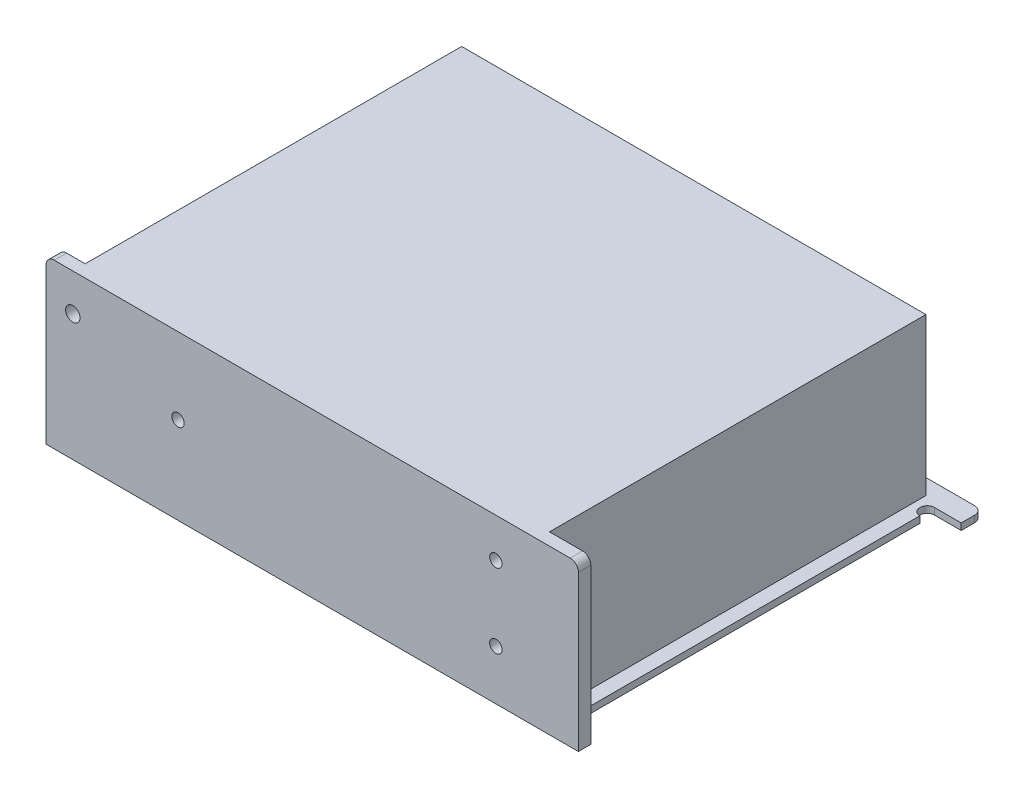
ISO-10303-21;
HEADER;
FILE_DESCRIPTION(('STEP AP214'),'2;1');
FILE_NAME('part.step','',(''),(''),'','','');
FILE_SCHEMA(('AUTOMOTIVE_DESIGN { 1 0 10303 214 1 1 1 1 }'));
ENDSEC;
DATA;
#1=APPLICATION_CONTEXT('core data for automotive mechanical design processes');
#2=APPLICATION_PROTOCOL_DEFINITION('international standard','automotive_design',2000,#1);
#3=PRODUCT_CONTEXT('',#1,'mechanical');
#4=PRODUCT('Part','Part','',(#3));
#5=PRODUCT_RELATED_PRODUCT_CATEGORY('part','',(#4));
#6=PRODUCT_DEFINITION_FORMATION('','',#4);
#7=PRODUCT_DEFINITION_CONTEXT('part definition',#1,'design');
#8=PRODUCT_DEFINITION('design','',#6,#7);
#9=PRODUCT_DEFINITION_SHAPE('','',#8);
#10=(LENGTH_UNIT() NAMED_UNIT(*) SI_UNIT(.MILLI.,.METRE.));
#11=(NAMED_UNIT(*) PLANE_ANGLE_UNIT() SI_UNIT($,.RADIAN.));
#12=(NAMED_UNIT(*) SI_UNIT($,.STERADIAN.) SOLID_ANGLE_UNIT());
#13=UNCERTAINTY_MEASURE_WITH_UNIT(LENGTH_MEASURE(1.E-05),#10,'distance_accuracy_value','');
#14=(GEOMETRIC_REPRESENTATION_CONTEXT(3) GLOBAL_UNCERTAINTY_ASSIGNED_CONTEXT((#13)) GLOBAL_UNIT_ASSIGNED_CONTEXT((#10,
#11,#12)) REPRESENTATION_CONTEXT('',''));
#15=CARTESIAN_POINT('',(0.,0.,0.));
#16=DIRECTION('',(0.,0.,1.));
#17=DIRECTION('',(1.,0.,0.));
#18=AXIS2_PLACEMENT_3D('',#15,#16,#17);
#19=CARTESIAN_POINT('',(54.4802631578947,1.6,-42.));
#20=DIRECTION('',(0.,1.,0.));
#21=DIRECTION('',(0.,0.,1.));
#22=AXIS2_PLACEMENT_3D('',#19,#20,#21);
#23=PLANE('',#22);
#24=CARTESIAN_POINT('',(-63.5197368421053,1.6,43.5));
#25=DIRECTION('',(0.,1.,0.));
#26=DIRECTION('',(0.,0.,1.));
#27=AXIS2_PLACEMENT_3D('',#24,#25,#26);
#28=CIRCLE('',#27,1.75);
#29=CARTESIAN_POINT('',(-63.5197368421053,1.6,45.25));
#30=VERTEX_POINT('',#29);
#31=EDGE_CURVE('E696',#30,#30,#28,.T.);
#32=ORIENTED_EDGE('',*,*,#31,.F.);
#33=EDGE_LOOP('',(#32));
#34=FACE_BOUND('',#33,.T.);
#35=DIRECTION('',(0.,0.,-1.));
#36=VECTOR('',#35,1.);
#37=CARTESIAN_POINT('',(60.9802631578947,1.6,-43.75));
#38=LINE('',#37,#36);
#39=CARTESIAN_POINT('',(60.9802631578947,1.6,-43.75));
#40=VERTEX_POINT('',#39);
#41=CARTESIAN_POINT('',(60.9802631578947,1.6,-47.));
#42=VERTEX_POINT('',#41);
#43=EDGE_CURVE('E273',#40,#42,#38,.T.);
#44=ORIENTED_EDGE('',*,*,#43,.T.);
#45=CARTESIAN_POINT('',(58.9802631578947,1.6,-47.));
#46=DIRECTION('',(0.,1.,0.));
#47=DIRECTION('',(0.,0.,1.));
#48=AXIS2_PLACEMENT_3D('',#45,#46,#47);
#49=CIRCLE('',#48,2.);
#50=CARTESIAN_POINT('',(58.9802631578947,1.6,-49.));
#51=VERTEX_POINT('',#50);
#52=EDGE_CURVE('E195',#42,#51,#49,.T.);
#53=ORIENTED_EDGE('',*,*,#52,.T.);
#54=DIRECTION('',(-1.,0.,0.));
#55=VECTOR('',#54,1.);
#56=CARTESIAN_POINT('',(-68.0197368421053,1.6,-49.));
#57=LINE('',#56,#55);
#58=CARTESIAN_POINT('',(-68.0197368421053,1.6,-49.));
#59=VERTEX_POINT('',#58);
#60=EDGE_CURVE('E261',#51,#59,#57,.T.);
#61=ORIENTED_EDGE('',*,*,#60,.T.);
#62=DIRECTION('',(0.,0.,1.));
#63=VECTOR('',#62,1.);
#64=CARTESIAN_POINT('',(-68.0197368421053,1.6,-49.));
#65=LINE('',#64,#63);
#66=CARTESIAN_POINT('',(-68.0197368421053,1.6,46.));
#67=VERTEX_POINT('',#66);
#68=EDGE_CURVE('E263',#59,#67,#65,.T.);
#69=ORIENTED_EDGE('',*,*,#68,.T.);
#70=DIRECTION('',(-1.,0.,0.));
#71=VECTOR('',#70,1.);
#72=CARTESIAN_POINT('',(60.9802631578947,1.6,46.));
#73=LINE('',#72,#71);
#74=CARTESIAN_POINT('',(-61.5197368421053,1.6,46.));
#75=VERTEX_POINT('',#74);
#76=EDGE_CURVE('E231',#75,#67,#73,.T.);
#77=ORIENTED_EDGE('',*,*,#76,.F.);
#78=DIRECTION('',(0.,0.,1.));
#79=VECTOR('',#78,1.);
#80=CARTESIAN_POINT('',(-61.5197368421053,1.6,-45.2099347918176));
#81=LINE('',#80,#79);
#82=CARTESIAN_POINT('',(-61.5197368421053,1.6,-45.2099347918176));
#83=VERTEX_POINT('',#82);
#84=EDGE_CURVE('E226',#83,#75,#81,.T.);
#85=ORIENTED_EDGE('',*,*,#84,.F.);
#86=DIRECTION('',(-1.,0.,0.));
#87=VECTOR('',#86,1.);
#88=CARTESIAN_POINT('',(-61.5197368421053,1.6,-45.2099347918176));
#89=LINE('',#88,#87);
#90=CARTESIAN_POINT('',(50.9802631578947,1.6,-45.2099347918176));
#91=VERTEX_POINT('',#90);
#92=EDGE_CURVE('E239',#91,#83,#89,.T.);
#93=ORIENTED_EDGE('',*,*,#92,.F.);
#94=DIRECTION('',(0.,0.,-1.));
#95=VECTOR('',#94,1.);
#96=CARTESIAN_POINT('',(50.9802631578947,1.6,-45.2099347918176));
#97=LINE('',#96,#95);
#98=CARTESIAN_POINT('',(50.9802631578947,1.6,46.));
#99=VERTEX_POINT('',#98);
#100=EDGE_CURVE('E246',#99,#91,#97,.T.);
#101=ORIENTED_EDGE('',*,*,#100,.F.);
#102=CARTESIAN_POINT('',(54.4802631578947,1.6,46.));
#103=VERTEX_POINT('',#102);
#104=EDGE_CURVE('E233',#103,#99,#73,.T.);
#105=ORIENTED_EDGE('',*,*,#104,.F.);
#106=DIRECTION('',(0.,0.,-1.));
#107=VECTOR('',#106,1.);
#108=CARTESIAN_POINT('',(54.4802631578947,1.6,-40.25));
#109=LINE('',#108,#107);
#110=CARTESIAN_POINT('',(54.4802631578947,1.6,-40.25));
#111=VERTEX_POINT('',#110);
#112=EDGE_CURVE('E267',#103,#111,#109,.T.);
#113=ORIENTED_EDGE('',*,*,#112,.T.);
#114=CARTESIAN_POINT('',(54.4802631578947,1.6,-42.));
#115=DIRECTION('',(0.,-1.,0.));
#116=DIRECTION('',(0.,0.,1.));
#117=AXIS2_PLACEMENT_3D('',#114,#115,#116);
#118=CIRCLE('',#117,1.75);
#119=CARTESIAN_POINT('',(54.4802631578947,1.6,-43.75));
#120=VERTEX_POINT('',#119);
#121=EDGE_CURVE('E269',#111,#120,#118,.T.);
#122=ORIENTED_EDGE('',*,*,#121,.T.);
#123=DIRECTION('',(1.,0.,0.));
#124=VECTOR('',#123,1.);
#125=CARTESIAN_POINT('',(54.4802631578947,1.6,-43.75));
#126=LINE('',#125,#124);
#127=EDGE_CURVE('E271',#120,#40,#126,.T.);
#128=ORIENTED_EDGE('',*,*,#127,.T.);
#129=EDGE_LOOP('',(#44,#53,#61,#69,#77,#85,#93,#101,#105,#113,#122,#128));
#130=FACE_BOUND('',#129,.T.);
#131=ADVANCED_FACE('F33',(#34,#130),#23,.T.);
#132=CARTESIAN_POINT('',(-68.0197368421053,1.6,-49.));
#133=DIRECTION('',(0.,0.,1.));
#134=DIRECTION('',(1.,0.,0.));
#135=AXIS2_PLACEMENT_3D('',#132,#133,#134);
#136=PLANE('',#135);
#137=ORIENTED_EDGE('',*,*,#60,.F.);
#138=DIRECTION('',(0.,-1.,0.));
#139=VECTOR('',#138,1.);
#140=CARTESIAN_POINT('',(58.9802631578947,1.6,-49.));
#141=LINE('',#140,#139);
#142=CARTESIAN_POINT('',(58.9802631578947,0.,-49.));
#143=VERTEX_POINT('',#142);
#144=EDGE_CURVE('E183',#51,#143,#141,.T.);
#145=ORIENTED_EDGE('',*,*,#144,.T.);
#146=DIRECTION('',(-1.,0.,0.));
#147=VECTOR('',#146,1.);
#148=CARTESIAN_POINT('',(-68.0197368421053,0.,-49.));
#149=LINE('',#148,#147);
#150=CARTESIAN_POINT('',(-68.0197368421053,0.,-49.));
#151=VERTEX_POINT('',#150);
#152=EDGE_CURVE('E260',#143,#151,#149,.T.);
#153=ORIENTED_EDGE('',*,*,#152,.T.);
#154=DIRECTION('',(0.,-1.,0.));
#155=VECTOR('',#154,1.);
#156=CARTESIAN_POINT('',(-68.0197368421053,1.6,-49.));
#157=LINE('',#156,#155);
#158=EDGE_CURVE('E188',#59,#151,#157,.T.);
#159=ORIENTED_EDGE('',*,*,#158,.F.);
#160=EDGE_LOOP('',(#137,#145,#153,#159));
#161=FACE_BOUND('',#160,.T.);
#162=ADVANCED_FACE('F321',(#161),#136,.F.);
#163=CARTESIAN_POINT('',(-68.0197368421053,1.6,-49.));
#164=DIRECTION('',(1.,0.,0.));
#165=DIRECTION('',(0.,0.,-1.));
#166=AXIS2_PLACEMENT_3D('',#163,#164,#165);
#167=PLANE('',#166);
#168=DIRECTION('',(0.,-1.,0.));
#169=VECTOR('',#168,1.);
#170=CARTESIAN_POINT('',(-68.0197368421053,1.6,49.));
#171=LINE('',#170,#169);
#172=CARTESIAN_POINT('',(-68.0197368421053,37.6,49.));
#173=VERTEX_POINT('',#172);
#174=CARTESIAN_POINT('',(-68.0197368421053,0.,49.));
#175=VERTEX_POINT('',#174);
#176=EDGE_CURVE('E312',#173,#175,#171,.T.);
#177=ORIENTED_EDGE('',*,*,#176,.F.);
#178=DIRECTION('',(0.,0.,1.));
#179=VECTOR('',#178,1.);
#180=CARTESIAN_POINT('',(-68.0197368421053,37.6,46.));
#181=LINE('',#180,#179);
#182=CARTESIAN_POINT('',(-68.0197368421053,37.6,46.));
#183=VERTEX_POINT('',#182);
#184=EDGE_CURVE('E41',#173,#183,#181,.F.);
#185=ORIENTED_EDGE('',*,*,#184,.T.);
#186=DIRECTION('',(0.,-1.,0.));
#187=VECTOR('',#186,1.);
#188=CARTESIAN_POINT('',(-68.0197368421053,39.6,46.));
#189=LINE('',#188,#187);
#190=EDGE_CURVE('E223',#183,#67,#189,.T.);
#191=ORIENTED_EDGE('',*,*,#190,.T.);
#192=ORIENTED_EDGE('',*,*,#68,.F.);
#193=ORIENTED_EDGE('',*,*,#158,.T.);
#194=DIRECTION('',(0.,0.,1.));
#195=VECTOR('',#194,1.);
#196=CARTESIAN_POINT('',(-68.0197368421053,0.,-49.));
#197=LINE('',#196,#195);
#198=EDGE_CURVE('E278',#151,#175,#197,.T.);
#199=ORIENTED_EDGE('',*,*,#198,.T.);
#200=EDGE_LOOP('',(#177,#185,#191,#192,#193,#199));
#201=FACE_BOUND('',#200,.T.);
#202=ADVANCED_FACE('F316',(#201),#167,.F.);
#203=CARTESIAN_POINT('',(-68.0197368421053,1.6,49.));
#204=DIRECTION('',(0.,0.,-1.));
#205=DIRECTION('',(-1.,0.,0.));
#206=AXIS2_PLACEMENT_3D('',#203,#204,#205);
#207=PLANE('',#206);
#208=CARTESIAN_POINT('',(-61.5197368421053,30.6,49.));
#209=DIRECTION('',(0.,0.,1.));
#210=DIRECTION('',(1.,0.,0.));
#211=AXIS2_PLACEMENT_3D('',#208,#209,#210);
#212=CIRCLE('',#211,1.75);
#213=CARTESIAN_POINT('',(-59.7697368421053,30.6,49.));
#214=VERTEX_POINT('',#213);
#215=EDGE_CURVE('E179',#214,#214,#212,.T.);
#216=ORIENTED_EDGE('',*,*,#215,.F.);
#217=EDGE_LOOP('',(#216));
#218=FACE_BOUND('',#217,.T.);
#219=CARTESIAN_POINT('',(40.9802631578947,30.1,49.));
#220=DIRECTION('',(0.,0.,1.));
#221=DIRECTION('',(1.,0.,0.));
#222=AXIS2_PLACEMENT_3D('',#219,#220,#221);
#223=CIRCLE('',#222,1.5);
#224=CARTESIAN_POINT('',(42.4802631578947,30.1,49.));
#225=VERTEX_POINT('',#224);
#226=EDGE_CURVE('E173',#225,#225,#223,.T.);
#227=ORIENTED_EDGE('',*,*,#226,.F.);
#228=EDGE_LOOP('',(#227));
#229=FACE_BOUND('',#228,.T.);
#230=CARTESIAN_POINT('',(40.9802631578947,12.1,49.));
#231=DIRECTION('',(0.,0.,1.));
#232=DIRECTION('',(1.,0.,0.));
#233=AXIS2_PLACEMENT_3D('',#230,#231,#232);
#234=CIRCLE('',#233,1.5);
#235=CARTESIAN_POINT('',(42.4802631578947,12.1,49.));
#236=VERTEX_POINT('',#235);
#237=EDGE_CURVE('E684',#236,#236,#234,.T.);
#238=ORIENTED_EDGE('',*,*,#237,.F.);
#239=EDGE_LOOP('',(#238));
#240=FACE_BOUND('',#239,.T.);
#241=CARTESIAN_POINT('',(-36.0197368421053,21.1,49.));
#242=DIRECTION('',(0.,0.,1.));
#243=DIRECTION('',(1.,0.,0.));
#244=AXIS2_PLACEMENT_3D('',#241,#242,#243);
#245=CIRCLE('',#244,1.5);
#246=CARTESIAN_POINT('',(-34.5197368421053,21.1,49.));
#247=VERTEX_POINT('',#246);
#248=EDGE_CURVE('E679',#247,#247,#245,.T.);
#249=ORIENTED_EDGE('',*,*,#248,.F.);
#250=EDGE_LOOP('',(#249));
#251=FACE_BOUND('',#250,.T.);
#252=DIRECTION('',(1.,0.,0.));
#253=VECTOR('',#252,1.);
#254=CARTESIAN_POINT('',(60.9802631578947,39.6,49.));
#255=LINE('',#254,#253);
#256=CARTESIAN_POINT('',(-66.0197368421053,39.6,49.));
#257=VERTEX_POINT('',#256);
#258=CARTESIAN_POINT('',(58.9802631578947,39.6,49.));
#259=VERTEX_POINT('',#258);
#260=EDGE_CURVE('E214',#257,#259,#255,.T.);
#261=ORIENTED_EDGE('',*,*,#260,.F.);
#262=CARTESIAN_POINT('',(-66.0197368421053,37.6,49.));
#263=DIRECTION('',(0.,0.,-1.));
#264=DIRECTION('',(-1.,0.,0.));
#265=AXIS2_PLACEMENT_3D('',#262,#263,#264);
#266=CIRCLE('',#265,2.);
#267=EDGE_CURVE('E55',#257,#173,#266,.F.);
#268=ORIENTED_EDGE('',*,*,#267,.T.);
#269=ORIENTED_EDGE('',*,*,#176,.T.);
#270=DIRECTION('',(1.,0.,0.));
#271=VECTOR('',#270,1.);
#272=CARTESIAN_POINT('',(-68.0197368421053,0.,49.));
#273=LINE('',#272,#271);
#274=CARTESIAN_POINT('',(60.9802631578947,0.,49.));
#275=VERTEX_POINT('',#274);
#276=EDGE_CURVE('E281',#175,#275,#273,.T.);
#277=ORIENTED_EDGE('',*,*,#276,.T.);
#278=DIRECTION('',(0.,-1.,0.));
#279=VECTOR('',#278,1.);
#280=CARTESIAN_POINT('',(60.9802631578947,1.6,49.));
#281=LINE('',#280,#279);
#282=CARTESIAN_POINT('',(60.9802631578947,37.6,49.));
#283=VERTEX_POINT('',#282);
#284=EDGE_CURVE('E310',#283,#275,#281,.T.);
#285=ORIENTED_EDGE('',*,*,#284,.F.);
#286=CARTESIAN_POINT('',(58.9802631578947,37.6,49.));
#287=DIRECTION('',(0.,0.,-1.));
#288=DIRECTION('',(-1.,0.,0.));
#289=AXIS2_PLACEMENT_3D('',#286,#287,#288);
#290=CIRCLE('',#289,2.);
#291=EDGE_CURVE('E204',#283,#259,#290,.F.);
#292=ORIENTED_EDGE('',*,*,#291,.T.);
#293=EDGE_LOOP('',(#261,#268,#269,#277,#285,#292));
#294=FACE_BOUND('',#293,.T.);
#295=ADVANCED_FACE('F219',(#218,#229,#240,#251,#294),#207,.F.);
#296=CARTESIAN_POINT('',(60.9802631578947,1.6,46.));
#297=DIRECTION('',(-1.,0.,0.));
#298=DIRECTION('',(0.,0.,1.));
#299=AXIS2_PLACEMENT_3D('',#296,#297,#298);
#300=PLANE('',#299);
#301=DIRECTION('',(0.,-1.,0.));
#302=VECTOR('',#301,1.);
#303=CARTESIAN_POINT('',(60.9802631578947,1.6,46.));
#304=LINE('',#303,#302);
#305=CARTESIAN_POINT('',(60.9802631578947,37.6,46.));
#306=VERTEX_POINT('',#305);
#307=CARTESIAN_POINT('',(60.9802631578947,0.,46.));
#308=VERTEX_POINT('',#307);
#309=EDGE_CURVE('E308',#306,#308,#304,.T.);
#310=ORIENTED_EDGE('',*,*,#309,.F.);
#311=DIRECTION('',(0.,0.,-1.));
#312=VECTOR('',#311,1.);
#313=CARTESIAN_POINT('',(60.9802631578947,37.6,49.));
#314=LINE('',#313,#312);
#315=EDGE_CURVE('E202',#306,#283,#314,.F.);
#316=ORIENTED_EDGE('',*,*,#315,.T.);
#317=ORIENTED_EDGE('',*,*,#284,.T.);
#318=DIRECTION('',(0.,0.,-1.));
#319=VECTOR('',#318,1.);
#320=CARTESIAN_POINT('',(60.9802631578947,0.,46.));
#321=LINE('',#320,#319);
#322=EDGE_CURVE('E284',#275,#308,#321,.T.);
#323=ORIENTED_EDGE('',*,*,#322,.T.);
#324=EDGE_LOOP('',(#310,#316,#317,#323));
#325=FACE_BOUND('',#324,.T.);
#326=ADVANCED_FACE('F364',(#325),#300,.F.);
#327=CARTESIAN_POINT('',(54.4802631578947,1.6,46.));
#328=DIRECTION('',(0.,0.,1.));
#329=DIRECTION('',(1.,0.,0.));
#330=AXIS2_PLACEMENT_3D('',#327,#328,#329);
#331=PLANE('',#330);
#332=DIRECTION('',(-1.,0.,0.));
#333=VECTOR('',#332,1.);
#334=CARTESIAN_POINT('',(60.9802631578947,39.6,46.));
#335=LINE('',#334,#333);
#336=CARTESIAN_POINT('',(58.9802631578947,39.6,46.));
#337=VERTEX_POINT('',#336);
#338=CARTESIAN_POINT('',(50.9802631578947,39.6,46.));
#339=VERTEX_POINT('',#338);
#340=EDGE_CURVE('E224',#337,#339,#335,.T.);
#341=ORIENTED_EDGE('',*,*,#340,.F.);
#342=CARTESIAN_POINT('',(58.9802631578947,37.6,46.));
#343=DIRECTION('',(0.,0.,1.));
#344=DIRECTION('',(1.,0.,0.));
#345=AXIS2_PLACEMENT_3D('',#342,#343,#344);
#346=CIRCLE('',#345,2.);
#347=EDGE_CURVE('E200',#337,#306,#346,.F.);
#348=ORIENTED_EDGE('',*,*,#347,.T.);
#349=ORIENTED_EDGE('',*,*,#309,.T.);
#350=DIRECTION('',(-1.,0.,0.));
#351=VECTOR('',#350,1.);
#352=CARTESIAN_POINT('',(54.4802631578947,0.,46.));
#353=LINE('',#352,#351);
#354=CARTESIAN_POINT('',(54.4802631578947,0.,46.));
#355=VERTEX_POINT('',#354);
#356=EDGE_CURVE('E287',#308,#355,#353,.T.);
#357=ORIENTED_EDGE('',*,*,#356,.T.);
#358=DIRECTION('',(0.,-1.,0.));
#359=VECTOR('',#358,1.);
#360=CARTESIAN_POINT('',(54.4802631578947,1.6,46.));
#361=LINE('',#360,#359);
#362=EDGE_CURVE('E305',#103,#355,#361,.T.);
#363=ORIENTED_EDGE('',*,*,#362,.F.);
#364=ORIENTED_EDGE('',*,*,#104,.T.);
#365=DIRECTION('',(0.,-1.,0.));
#366=VECTOR('',#365,1.);
#367=CARTESIAN_POINT('',(50.9802631578947,39.6,46.));
#368=LINE('',#367,#366);
#369=EDGE_CURVE('E254',#339,#99,#368,.T.);
#370=ORIENTED_EDGE('',*,*,#369,.F.);
#371=EDGE_LOOP('',(#341,#348,#349,#357,#363,#364,#370));
#372=FACE_BOUND('',#371,.T.);
#373=ADVANCED_FACE('F359',(#372),#331,.F.);
#374=CARTESIAN_POINT('',(54.4802631578947,1.6,-40.25));
#375=DIRECTION('',(-1.,0.,0.));
#376=DIRECTION('',(0.,0.,1.));
#377=AXIS2_PLACEMENT_3D('',#374,#375,#376);
#378=PLANE('',#377);
#379=DIRECTION('',(0.,0.,-1.));
#380=VECTOR('',#379,1.);
#381=CARTESIAN_POINT('',(54.4802631578947,0.,-40.25));
#382=LINE('',#381,#380);
#383=CARTESIAN_POINT('',(54.4802631578947,0.,-40.25));
#384=VERTEX_POINT('',#383);
#385=EDGE_CURVE('E289',#355,#384,#382,.T.);
#386=ORIENTED_EDGE('',*,*,#385,.T.);
#387=DIRECTION('',(0.,-1.,0.));
#388=VECTOR('',#387,1.);
#389=CARTESIAN_POINT('',(54.4802631578947,1.6,-40.25));
#390=LINE('',#389,#388);
#391=EDGE_CURVE('E302',#111,#384,#390,.T.);
#392=ORIENTED_EDGE('',*,*,#391,.F.);
#393=ORIENTED_EDGE('',*,*,#112,.F.);
#394=ORIENTED_EDGE('',*,*,#362,.T.);
#395=EDGE_LOOP('',(#386,#392,#393,#394));
#396=FACE_BOUND('',#395,.T.);
#397=ADVANCED_FACE('F355',(#396),#378,.F.);
#398=CARTESIAN_POINT('',(54.4802631578947,1.6,-42.));
#399=DIRECTION('',(0.,-1.,0.));
#400=DIRECTION('',(0.,0.,-1.));
#401=AXIS2_PLACEMENT_3D('',#398,#399,#400);
#402=CYLINDRICAL_SURFACE('',#401,1.75);
#403=CARTESIAN_POINT('',(54.4802631578947,0.,-42.));
#404=DIRECTION('',(0.,-1.,0.));
#405=DIRECTION('',(0.,0.,1.));
#406=AXIS2_PLACEMENT_3D('',#403,#404,#405);
#407=CIRCLE('',#406,1.75);
#408=CARTESIAN_POINT('',(54.4802631578947,0.,-43.75));
#409=VERTEX_POINT('',#408);
#410=EDGE_CURVE('E291',#384,#409,#407,.T.);
#411=ORIENTED_EDGE('',*,*,#410,.T.);
#412=DIRECTION('',(0.,-1.,0.));
#413=VECTOR('',#412,1.);
#414=CARTESIAN_POINT('',(54.4802631578947,1.6,-43.75));
#415=LINE('',#414,#413);
#416=EDGE_CURVE('E299',#120,#409,#415,.T.);
#417=ORIENTED_EDGE('',*,*,#416,.F.);
#418=ORIENTED_EDGE('',*,*,#121,.F.);
#419=ORIENTED_EDGE('',*,*,#391,.T.);
#420=EDGE_LOOP('',(#411,#417,#418,#419));
#421=FACE_BOUND('',#420,.T.);
#422=ADVANCED_FACE('F350',(#421),#402,.F.);
#423=CARTESIAN_POINT('',(54.4802631578947,1.6,-43.75));
#424=DIRECTION('',(0.,0.,-1.));
#425=DIRECTION('',(-1.,0.,0.));
#426=AXIS2_PLACEMENT_3D('',#423,#424,#425);
#427=PLANE('',#426);
#428=DIRECTION('',(1.,0.,0.));
#429=VECTOR('',#428,1.);
#430=CARTESIAN_POINT('',(54.4802631578947,0.,-43.75));
#431=LINE('',#430,#429);
#432=CARTESIAN_POINT('',(60.9802631578947,0.,-43.75));
#433=VERTEX_POINT('',#432);
#434=EDGE_CURVE('E293',#409,#433,#431,.T.);
#435=ORIENTED_EDGE('',*,*,#434,.T.);
#436=DIRECTION('',(0.,-1.,0.));
#437=VECTOR('',#436,1.);
#438=CARTESIAN_POINT('',(60.9802631578947,1.6,-43.75));
#439=LINE('',#438,#437);
#440=EDGE_CURVE('E276',#40,#433,#439,.T.);
#441=ORIENTED_EDGE('',*,*,#440,.F.);
#442=ORIENTED_EDGE('',*,*,#127,.F.);
#443=ORIENTED_EDGE('',*,*,#416,.T.);
#444=EDGE_LOOP('',(#435,#441,#442,#443));
#445=FACE_BOUND('',#444,.T.);
#446=ADVANCED_FACE('F345',(#445),#427,.F.);
#447=CARTESIAN_POINT('',(60.9802631578947,1.6,-43.75));
#448=DIRECTION('',(-1.,0.,0.));
#449=DIRECTION('',(0.,0.,1.));
#450=AXIS2_PLACEMENT_3D('',#447,#448,#449);
#451=PLANE('',#450);
#452=DIRECTION('',(0.,0.,-1.));
#453=VECTOR('',#452,1.);
#454=CARTESIAN_POINT('',(60.9802631578947,0.,-43.75));
#455=LINE('',#454,#453);
#456=CARTESIAN_POINT('',(60.9802631578947,0.,-47.));
#457=VERTEX_POINT('',#456);
#458=EDGE_CURVE('E264',#433,#457,#455,.T.);
#459=ORIENTED_EDGE('',*,*,#458,.T.);
#460=DIRECTION('',(0.,-1.,0.));
#461=VECTOR('',#460,1.);
#462=CARTESIAN_POINT('',(60.9802631578947,1.6,-47.));
#463=LINE('',#462,#461);
#464=EDGE_CURVE('E193',#457,#42,#463,.F.);
#465=ORIENTED_EDGE('',*,*,#464,.T.);
#466=ORIENTED_EDGE('',*,*,#43,.F.);
#467=ORIENTED_EDGE('',*,*,#440,.T.);
#468=EDGE_LOOP('',(#459,#465,#466,#467));
#469=FACE_BOUND('',#468,.T.);
#470=ADVANCED_FACE('F341',(#469),#451,.F.);
#471=CARTESIAN_POINT('',(54.4802631578947,0.,-42.));
#472=DIRECTION('',(0.,1.,0.));
#473=DIRECTION('',(0.,0.,1.));
#474=AXIS2_PLACEMENT_3D('',#471,#472,#473);
#475=PLANE('',#474);
#476=CARTESIAN_POINT('',(9.98026315789473,0.,-15.));
#477=DIRECTION('',(0.,-1.,0.));
#478=DIRECTION('',(0.,0.,-1.));
#479=AXIS2_PLACEMENT_3D('',#476,#477,#478);
#480=CIRCLE('',#479,1.5);
#481=CARTESIAN_POINT('',(9.98026315789473,0.,-16.5));
#482=VERTEX_POINT('',#481);
#483=EDGE_CURVE('E710',#482,#482,#480,.T.);
#484=ORIENTED_EDGE('',*,*,#483,.F.);
#485=EDGE_LOOP('',(#484));
#486=FACE_BOUND('',#485,.T.);
#487=CARTESIAN_POINT('',(9.98026315789473,0.,18.));
#488=DIRECTION('',(0.,-1.,0.));
#489=DIRECTION('',(0.,0.,-1.));
#490=AXIS2_PLACEMENT_3D('',#487,#488,#489);
#491=CIRCLE('',#490,1.5);
#492=CARTESIAN_POINT('',(9.98026315789473,0.,16.5));
#493=VERTEX_POINT('',#492);
#494=EDGE_CURVE('E704',#493,#493,#491,.T.);
#495=ORIENTED_EDGE('',*,*,#494,.F.);
#496=EDGE_LOOP('',(#495));
#497=FACE_BOUND('',#496,.T.);
#498=CARTESIAN_POINT('',(-63.5197368421053,0.,43.5));
#499=DIRECTION('',(0.,-1.,0.));
#500=DIRECTION('',(0.,0.,-1.));
#501=AXIS2_PLACEMENT_3D('',#498,#499,#500);
#502=CIRCLE('',#501,1.75);
#503=CARTESIAN_POINT('',(-63.5197368421053,0.,41.75));
#504=VERTEX_POINT('',#503);
#505=EDGE_CURVE('E700',#504,#504,#502,.T.);
#506=ORIENTED_EDGE('',*,*,#505,.F.);
#507=EDGE_LOOP('',(#506));
#508=FACE_BOUND('',#507,.T.);
#509=ORIENTED_EDGE('',*,*,#152,.F.);
#510=CARTESIAN_POINT('',(58.9802631578947,0.,-47.));
#511=DIRECTION('',(0.,1.,0.));
#512=DIRECTION('',(0.,0.,1.));
#513=AXIS2_PLACEMENT_3D('',#510,#511,#512);
#514=CIRCLE('',#513,2.);
#515=EDGE_CURVE('E186',#143,#457,#514,.F.);
#516=ORIENTED_EDGE('',*,*,#515,.T.);
#517=ORIENTED_EDGE('',*,*,#458,.F.);
#518=ORIENTED_EDGE('',*,*,#434,.F.);
#519=ORIENTED_EDGE('',*,*,#410,.F.);
#520=ORIENTED_EDGE('',*,*,#385,.F.);
#521=ORIENTED_EDGE('',*,*,#356,.F.);
#522=ORIENTED_EDGE('',*,*,#322,.F.);
#523=ORIENTED_EDGE('',*,*,#276,.F.);
#524=ORIENTED_EDGE('',*,*,#198,.F.);
#525=EDGE_LOOP('',(#509,#516,#517,#518,#519,#520,#521,#522,#523,#524));
#526=FACE_BOUND('',#525,.T.);
#527=ADVANCED_FACE('F325',(#486,#497,#508,#526),#475,.F.);
#528=CARTESIAN_POINT('',(-61.5197368421053,39.6,-45.2099347918176));
#529=DIRECTION('',(1.,0.,0.));
#530=DIRECTION('',(0.,0.,-1.));
#531=AXIS2_PLACEMENT_3D('',#528,#529,#530);
#532=PLANE('',#531);
#533=DIRECTION('',(0.,-1.,0.));
#534=VECTOR('',#533,1.);
#535=CARTESIAN_POINT('',(-61.5197368421053,39.6,45.));
#536=LINE('',#535,#534);
#537=CARTESIAN_POINT('',(-61.5197368421053,32.35,45.));
#538=VERTEX_POINT('',#537);
#539=CARTESIAN_POINT('',(-61.5197368421053,28.85,45.));
#540=VERTEX_POINT('',#539);
#541=EDGE_CURVE('E178',#538,#540,#536,.T.);
#542=ORIENTED_EDGE('',*,*,#541,.F.);
#543=DIRECTION('',(0.,0.,1.));
#544=VECTOR('',#543,1.);
#545=CARTESIAN_POINT('',(-61.5197368421053,32.35,45.));
#546=LINE('',#545,#544);
#547=CARTESIAN_POINT('',(-61.5197368421053,32.35,46.));
#548=VERTEX_POINT('',#547);
#549=EDGE_CURVE('E162',#538,#548,#546,.T.);
#550=ORIENTED_EDGE('',*,*,#549,.T.);
#551=DIRECTION('',(0.,-1.,0.));
#552=VECTOR('',#551,1.);
#553=CARTESIAN_POINT('',(-61.5197368421053,39.6,46.));
#554=LINE('',#553,#552);
#555=CARTESIAN_POINT('',(-61.5197368421053,39.6,46.));
#556=VERTEX_POINT('',#555);
#557=EDGE_CURVE('E258',#556,#548,#554,.T.);
#558=ORIENTED_EDGE('',*,*,#557,.F.);
#559=DIRECTION('',(0.,0.,1.));
#560=VECTOR('',#559,1.);
#561=CARTESIAN_POINT('',(-61.5197368421053,39.6,-45.2099347918176));
#562=LINE('',#561,#560);
#563=CARTESIAN_POINT('',(-61.5197368421053,39.6,-45.2099347918176));
#564=VERTEX_POINT('',#563);
#565=EDGE_CURVE('E236',#564,#556,#562,.T.);
#566=ORIENTED_EDGE('',*,*,#565,.F.);
#567=DIRECTION('',(0.,-1.,0.));
#568=VECTOR('',#567,1.);
#569=CARTESIAN_POINT('',(-61.5197368421053,39.6,-45.2099347918176));
#570=LINE('',#569,#568);
#571=EDGE_CURVE('E243',#564,#83,#570,.T.);
#572=ORIENTED_EDGE('',*,*,#571,.T.);
#573=ORIENTED_EDGE('',*,*,#84,.T.);
#574=CARTESIAN_POINT('',(-61.5197368421053,28.85,46.));
#575=VERTEX_POINT('',#574);
#576=EDGE_CURVE('E257',#575,#75,#554,.T.);
#577=ORIENTED_EDGE('',*,*,#576,.F.);
#578=DIRECTION('',(0.,0.,1.));
#579=VECTOR('',#578,1.);
#580=CARTESIAN_POINT('',(-61.5197368421053,28.85,45.));
#581=LINE('',#580,#579);
#582=EDGE_CURVE('E174',#575,#540,#581,.F.);
#583=ORIENTED_EDGE('',*,*,#582,.T.);
#584=EDGE_LOOP('',(#542,#550,#558,#566,#572,#573,#577,#583));
#585=FACE_BOUND('',#584,.T.);
#586=ADVANCED_FACE('F181',(#585),#532,.F.);
#587=CARTESIAN_POINT('',(50.9802631578947,39.6,-45.2099347918176));
#588=DIRECTION('',(-1.,0.,0.));
#589=DIRECTION('',(0.,0.,1.));
#590=AXIS2_PLACEMENT_3D('',#587,#588,#589);
#591=PLANE('',#590);
#592=ORIENTED_EDGE('',*,*,#100,.T.);
#593=DIRECTION('',(0.,-1.,0.));
#594=VECTOR('',#593,1.);
#595=CARTESIAN_POINT('',(50.9802631578947,39.6,-45.2099347918176));
#596=LINE('',#595,#594);
#597=CARTESIAN_POINT('',(50.9802631578947,39.6,-45.2099347918176));
#598=VERTEX_POINT('',#597);
#599=EDGE_CURVE('E252',#598,#91,#596,.T.);
#600=ORIENTED_EDGE('',*,*,#599,.F.);
#601=DIRECTION('',(0.,0.,-1.));
#602=VECTOR('',#601,1.);
#603=CARTESIAN_POINT('',(50.9802631578947,39.6,-45.2099347918176));
#604=LINE('',#603,#602);
#605=EDGE_CURVE('E238',#339,#598,#604,.T.);
#606=ORIENTED_EDGE('',*,*,#605,.F.);
#607=ORIENTED_EDGE('',*,*,#369,.T.);
#608=EDGE_LOOP('',(#592,#600,#606,#607));
#609=FACE_BOUND('',#608,.T.);
#610=ADVANCED_FACE('F371',(#609),#591,.F.);
#611=CARTESIAN_POINT('',(-61.5197368421053,39.6,-45.2099347918176));
#612=DIRECTION('',(0.,0.,1.));
#613=DIRECTION('',(1.,0.,0.));
#614=AXIS2_PLACEMENT_3D('',#611,#612,#613);
#615=PLANE('',#614);
#616=ORIENTED_EDGE('',*,*,#92,.T.);
#617=ORIENTED_EDGE('',*,*,#571,.F.);
#618=DIRECTION('',(-1.,0.,0.));
#619=VECTOR('',#618,1.);
#620=CARTESIAN_POINT('',(-61.5197368421053,39.6,-45.2099347918176));
#621=LINE('',#620,#619);
#622=EDGE_CURVE('E241',#598,#564,#621,.T.);
#623=ORIENTED_EDGE('',*,*,#622,.F.);
#624=ORIENTED_EDGE('',*,*,#599,.T.);
#625=EDGE_LOOP('',(#616,#617,#623,#624));
#626=FACE_BOUND('',#625,.T.);
#627=ADVANCED_FACE('F376',(#626),#615,.F.);
#628=CARTESIAN_POINT('',(0.,39.6,0.));
#629=DIRECTION('',(0.,1.,0.));
#630=DIRECTION('',(0.,0.,1.));
#631=AXIS2_PLACEMENT_3D('',#628,#629,#630);
#632=PLANE('',#631);
#633=CARTESIAN_POINT('',(-66.0197368421053,39.6,46.));
#634=VERTEX_POINT('',#633);
#635=EDGE_CURVE('E216',#556,#634,#335,.T.);
#636=ORIENTED_EDGE('',*,*,#635,.T.);
#637=DIRECTION('',(0.,0.,1.));
#638=VECTOR('',#637,1.);
#639=CARTESIAN_POINT('',(-66.0197368421053,39.6,49.));
#640=LINE('',#639,#638);
#641=EDGE_CURVE('E207',#634,#257,#640,.T.);
#642=ORIENTED_EDGE('',*,*,#641,.T.);
#643=ORIENTED_EDGE('',*,*,#260,.T.);
#644=DIRECTION('',(0.,0.,-1.));
#645=VECTOR('',#644,1.);
#646=CARTESIAN_POINT('',(58.9802631578947,39.6,46.));
#647=LINE('',#646,#645);
#648=EDGE_CURVE('E197',#259,#337,#647,.T.);
#649=ORIENTED_EDGE('',*,*,#648,.T.);
#650=ORIENTED_EDGE('',*,*,#340,.T.);
#651=ORIENTED_EDGE('',*,*,#605,.T.);
#652=ORIENTED_EDGE('',*,*,#622,.T.);
#653=ORIENTED_EDGE('',*,*,#565,.T.);
#654=EDGE_LOOP('',(#636,#642,#643,#649,#650,#651,#652,#653));
#655=FACE_BOUND('',#654,.T.);
#656=ADVANCED_FACE('F213',(#655),#632,.T.);
#657=CARTESIAN_POINT('',(60.9802631578947,39.6,46.));
#658=DIRECTION('',(0.,0.,1.));
#659=DIRECTION('',(1.,0.,0.));
#660=AXIS2_PLACEMENT_3D('',#657,#658,#659);
#661=PLANE('',#660);
#662=ORIENTED_EDGE('',*,*,#190,.F.);
#663=CARTESIAN_POINT('',(-66.0197368421053,37.6,46.));
#664=DIRECTION('',(0.,0.,1.));
#665=DIRECTION('',(1.,0.,0.));
#666=AXIS2_PLACEMENT_3D('',#663,#664,#665);
#667=CIRCLE('',#666,2.);
#668=EDGE_CURVE('E11',#183,#634,#667,.F.);
#669=ORIENTED_EDGE('',*,*,#668,.T.);
#670=ORIENTED_EDGE('',*,*,#635,.F.);
#671=ORIENTED_EDGE('',*,*,#557,.T.);
#672=CARTESIAN_POINT('',(-61.5197368421053,30.6,46.));
#673=DIRECTION('',(0.,0.,1.));
#674=DIRECTION('',(1.,0.,0.));
#675=AXIS2_PLACEMENT_3D('',#672,#673,#674);
#676=CIRCLE('',#675,1.75);
#677=EDGE_CURVE('E168',#548,#575,#676,.T.);
#678=ORIENTED_EDGE('',*,*,#677,.T.);
#679=ORIENTED_EDGE('',*,*,#576,.T.);
#680=ORIENTED_EDGE('',*,*,#76,.T.);
#681=EDGE_LOOP('',(#662,#669,#670,#671,#678,#679,#680));
#682=FACE_BOUND('',#681,.T.);
#683=ADVANCED_FACE('F329',(#682),#661,.F.);
#684=CARTESIAN_POINT('',(-36.0197368421053,21.1,45.));
#685=DIRECTION('',(0.,0.,1.));
#686=DIRECTION('',(1.,0.,0.));
#687=AXIS2_PLACEMENT_3D('',#684,#685,#686);
#688=CYLINDRICAL_SURFACE('',#687,1.5);
#689=CARTESIAN_POINT('',(-36.0197368421053,21.1,45.));
#690=DIRECTION('',(0.,0.,1.));
#691=DIRECTION('',(1.,0.,0.));
#692=AXIS2_PLACEMENT_3D('',#689,#690,#691);
#693=CIRCLE('',#692,1.5);
#694=CARTESIAN_POINT('',(-34.5197368421053,21.1,45.));
#695=VERTEX_POINT('',#694);
#696=EDGE_CURVE('E234',#695,#695,#693,.T.);
#697=ORIENTED_EDGE('',*,*,#696,.F.);
#698=EDGE_LOOP('',(#697));
#699=FACE_BOUND('',#698,.T.);
#700=ORIENTED_EDGE('',*,*,#248,.T.);
#701=EDGE_LOOP('',(#700));
#702=FACE_BOUND('',#701,.T.);
#703=ADVANCED_FACE('F434',(#699,#702),#688,.F.);
#704=CARTESIAN_POINT('',(-36.0197368421053,21.1,45.));
#705=DIRECTION('',(0.,0.,1.));
#706=DIRECTION('',(1.,0.,0.));
#707=AXIS2_PLACEMENT_3D('',#704,#705,#706);
#708=PLANE('',#707);
#709=ORIENTED_EDGE('',*,*,#696,.T.);
#710=EDGE_LOOP('',(#709));
#711=FACE_BOUND('',#710,.T.);
#712=ADVANCED_FACE('F611',(#711),#708,.T.);
#713=CARTESIAN_POINT('',(40.9802631578947,12.1,45.));
#714=DIRECTION('',(0.,0.,1.));
#715=DIRECTION('',(1.,0.,0.));
#716=AXIS2_PLACEMENT_3D('',#713,#714,#715);
#717=CYLINDRICAL_SURFACE('',#716,1.5);
#718=CARTESIAN_POINT('',(40.9802631578947,12.1,45.));
#719=DIRECTION('',(0.,0.,1.));
#720=DIRECTION('',(1.,0.,0.));
#721=AXIS2_PLACEMENT_3D('',#718,#719,#720);
#722=CIRCLE('',#721,1.5);
#723=CARTESIAN_POINT('',(42.4802631578947,12.1,45.));
#724=VERTEX_POINT('',#723);
#725=EDGE_CURVE('E681',#724,#724,#722,.T.);
#726=ORIENTED_EDGE('',*,*,#725,.F.);
#727=EDGE_LOOP('',(#726));
#728=FACE_BOUND('',#727,.T.);
#729=ORIENTED_EDGE('',*,*,#237,.T.);
#730=EDGE_LOOP('',(#729));
#731=FACE_BOUND('',#730,.T.);
#732=ADVANCED_FACE('F601',(#728,#731),#717,.F.);
#733=CARTESIAN_POINT('',(40.9802631578947,12.1,45.));
#734=DIRECTION('',(0.,0.,1.));
#735=DIRECTION('',(1.,0.,0.));
#736=AXIS2_PLACEMENT_3D('',#733,#734,#735);
#737=PLANE('',#736);
#738=ORIENTED_EDGE('',*,*,#725,.T.);
#739=EDGE_LOOP('',(#738));
#740=FACE_BOUND('',#739,.T.);
#741=ADVANCED_FACE('F591',(#740),#737,.T.);
#742=CARTESIAN_POINT('',(40.9802631578947,30.1,45.));
#743=DIRECTION('',(0.,0.,1.));
#744=DIRECTION('',(1.,0.,0.));
#745=AXIS2_PLACEMENT_3D('',#742,#743,#744);
#746=CYLINDRICAL_SURFACE('',#745,1.5);
#747=CARTESIAN_POINT('',(40.9802631578947,30.1,45.));
#748=DIRECTION('',(0.,0.,1.));
#749=DIRECTION('',(1.,0.,0.));
#750=AXIS2_PLACEMENT_3D('',#747,#748,#749);
#751=CIRCLE('',#750,1.5);
#752=CARTESIAN_POINT('',(42.4802631578947,30.1,45.));
#753=VERTEX_POINT('',#752);
#754=EDGE_CURVE('E688',#753,#753,#751,.T.);
#755=ORIENTED_EDGE('',*,*,#754,.F.);
#756=EDGE_LOOP('',(#755));
#757=FACE_BOUND('',#756,.T.);
#758=ORIENTED_EDGE('',*,*,#226,.T.);
#759=EDGE_LOOP('',(#758));
#760=FACE_BOUND('',#759,.T.);
#761=ADVANCED_FACE('F581',(#757,#760),#746,.F.);
#762=CARTESIAN_POINT('',(40.9802631578947,30.1,45.));
#763=DIRECTION('',(0.,0.,1.));
#764=DIRECTION('',(1.,0.,0.));
#765=AXIS2_PLACEMENT_3D('',#762,#763,#764);
#766=PLANE('',#765);
#767=ORIENTED_EDGE('',*,*,#754,.T.);
#768=EDGE_LOOP('',(#767));
#769=FACE_BOUND('',#768,.T.);
#770=ADVANCED_FACE('F572',(#769),#766,.T.);
#771=CARTESIAN_POINT('',(-61.5197368421053,30.6,45.));
#772=DIRECTION('',(0.,0.,1.));
#773=DIRECTION('',(1.,0.,0.));
#774=AXIS2_PLACEMENT_3D('',#771,#772,#773);
#775=PLANE('',#774);
#776=ORIENTED_EDGE('',*,*,#541,.T.);
#777=CARTESIAN_POINT('',(-61.5197368421053,30.6,45.));
#778=DIRECTION('',(0.,0.,1.));
#779=DIRECTION('',(1.,0.,0.));
#780=AXIS2_PLACEMENT_3D('',#777,#778,#779);
#781=CIRCLE('',#780,1.75);
#782=EDGE_CURVE('E165',#540,#538,#781,.T.);
#783=ORIENTED_EDGE('',*,*,#782,.T.);
#784=EDGE_LOOP('',(#776,#783));
#785=FACE_BOUND('',#784,.T.);
#786=ADVANCED_FACE('F177',(#785),#775,.T.);
#787=CARTESIAN_POINT('',(-61.5197368421053,30.6,45.));
#788=DIRECTION('',(0.,0.,1.));
#789=DIRECTION('',(1.,0.,0.));
#790=AXIS2_PLACEMENT_3D('',#787,#788,#789);
#791=CYLINDRICAL_SURFACE('',#790,1.75);
#792=ORIENTED_EDGE('',*,*,#215,.T.);
#793=EDGE_LOOP('',(#792));
#794=FACE_BOUND('',#793,.T.);
#795=ORIENTED_EDGE('',*,*,#782,.F.);
#796=ORIENTED_EDGE('',*,*,#582,.F.);
#797=ORIENTED_EDGE('',*,*,#677,.F.);
#798=ORIENTED_EDGE('',*,*,#549,.F.);
#799=EDGE_LOOP('',(#795,#796,#797,#798));
#800=FACE_BOUND('',#799,.T.);
#801=ADVANCED_FACE('F164',(#794,#800),#791,.F.);
#802=CARTESIAN_POINT('',(-63.5197368421053,4.,43.5));
#803=DIRECTION('',(0.,-1.,0.));
#804=DIRECTION('',(0.,0.,-1.));
#805=AXIS2_PLACEMENT_3D('',#802,#803,#804);
#806=CYLINDRICAL_SURFACE('',#805,1.75);
#807=ORIENTED_EDGE('',*,*,#31,.T.);
#808=EDGE_LOOP('',(#807));
#809=FACE_BOUND('',#808,.T.);
#810=ORIENTED_EDGE('',*,*,#505,.T.);
#811=EDGE_LOOP('',(#810));
#812=FACE_BOUND('',#811,.T.);
#813=ADVANCED_FACE('F544',(#809,#812),#806,.F.);
#814=CARTESIAN_POINT('',(9.98026315789473,4.,18.));
#815=DIRECTION('',(0.,-1.,0.));
#816=DIRECTION('',(0.,0.,-1.));
#817=AXIS2_PLACEMENT_3D('',#814,#815,#816);
#818=CYLINDRICAL_SURFACE('',#817,1.5);
#819=CARTESIAN_POINT('',(9.98026315789473,4.,18.));
#820=DIRECTION('',(0.,-1.,0.));
#821=DIRECTION('',(0.,0.,-1.));
#822=AXIS2_PLACEMENT_3D('',#819,#820,#821);
#823=CIRCLE('',#822,1.5);
#824=CARTESIAN_POINT('',(9.98026315789473,4.,16.5));
#825=VERTEX_POINT('',#824);
#826=EDGE_CURVE('E703',#825,#825,#823,.T.);
#827=ORIENTED_EDGE('',*,*,#826,.F.);
#828=EDGE_LOOP('',(#827));
#829=FACE_BOUND('',#828,.T.);
#830=ORIENTED_EDGE('',*,*,#494,.T.);
#831=EDGE_LOOP('',(#830));
#832=FACE_BOUND('',#831,.T.);
#833=ADVANCED_FACE('F534',(#829,#832),#818,.F.);
#834=CARTESIAN_POINT('',(9.98026315789473,4.,18.));
#835=DIRECTION('',(0.,-1.,0.));
#836=DIRECTION('',(0.,0.,-1.));
#837=AXIS2_PLACEMENT_3D('',#834,#835,#836);
#838=PLANE('',#837);
#839=ORIENTED_EDGE('',*,*,#826,.T.);
#840=EDGE_LOOP('',(#839));
#841=FACE_BOUND('',#840,.T.);
#842=ADVANCED_FACE('F524',(#841),#838,.T.);
#843=CARTESIAN_POINT('',(9.98026315789473,4.,-15.));
#844=DIRECTION('',(0.,-1.,0.));
#845=DIRECTION('',(0.,0.,-1.));
#846=AXIS2_PLACEMENT_3D('',#843,#844,#845);
#847=CYLINDRICAL_SURFACE('',#846,1.5);
#848=CARTESIAN_POINT('',(9.98026315789473,4.,-15.));
#849=DIRECTION('',(0.,-1.,0.));
#850=DIRECTION('',(0.,0.,-1.));
#851=AXIS2_PLACEMENT_3D('',#848,#849,#850);
#852=CIRCLE('',#851,1.5);
#853=CARTESIAN_POINT('',(9.98026315789473,4.,-16.5));
#854=VERTEX_POINT('',#853);
#855=EDGE_CURVE('E707',#854,#854,#852,.T.);
#856=ORIENTED_EDGE('',*,*,#855,.F.);
#857=EDGE_LOOP('',(#856));
#858=FACE_BOUND('',#857,.T.);
#859=ORIENTED_EDGE('',*,*,#483,.T.);
#860=EDGE_LOOP('',(#859));
#861=FACE_BOUND('',#860,.T.);
#862=ADVANCED_FACE('F514',(#858,#861),#847,.F.);
#863=CARTESIAN_POINT('',(9.98026315789473,4.,-15.));
#864=DIRECTION('',(0.,-1.,0.));
#865=DIRECTION('',(0.,0.,-1.));
#866=AXIS2_PLACEMENT_3D('',#863,#864,#865);
#867=PLANE('',#866);
#868=ORIENTED_EDGE('',*,*,#855,.T.);
#869=EDGE_LOOP('',(#868));
#870=FACE_BOUND('',#869,.T.);
#871=ADVANCED_FACE('F417',(#870),#867,.T.);
#872=CARTESIAN_POINT('',(58.9802631578947,1.6,-47.));
#873=DIRECTION('',(0.,-1.,0.));
#874=DIRECTION('',(0.,0.,-1.));
#875=AXIS2_PLACEMENT_3D('',#872,#873,#874);
#876=CYLINDRICAL_SURFACE('',#875,2.);
#877=ORIENTED_EDGE('',*,*,#52,.F.);
#878=ORIENTED_EDGE('',*,*,#464,.F.);
#879=ORIENTED_EDGE('',*,*,#515,.F.);
#880=ORIENTED_EDGE('',*,*,#144,.F.);
#881=EDGE_LOOP('',(#877,#878,#879,#880));
#882=FACE_BOUND('',#881,.T.);
#883=ADVANCED_FACE('F337',(#882),#876,.T.);
#884=CARTESIAN_POINT('',(58.9802631578947,37.6,0.));
#885=DIRECTION('',(0.,0.,1.));
#886=DIRECTION('',(1.,0.,0.));
#887=AXIS2_PLACEMENT_3D('',#884,#885,#886);
#888=CYLINDRICAL_SURFACE('',#887,2.);
#889=ORIENTED_EDGE('',*,*,#291,.F.);
#890=ORIENTED_EDGE('',*,*,#315,.F.);
#891=ORIENTED_EDGE('',*,*,#347,.F.);
#892=ORIENTED_EDGE('',*,*,#648,.F.);
#893=EDGE_LOOP('',(#889,#890,#891,#892));
#894=FACE_BOUND('',#893,.T.);
#895=ADVANCED_FACE('F366',(#894),#888,.T.);
#896=CARTESIAN_POINT('',(-66.0197368421053,37.6,0.));
#897=DIRECTION('',(0.,0.,-1.));
#898=DIRECTION('',(-1.,0.,0.));
#899=AXIS2_PLACEMENT_3D('',#896,#897,#898);
#900=CYLINDRICAL_SURFACE('',#899,2.);
#901=ORIENTED_EDGE('',*,*,#668,.F.);
#902=ORIENTED_EDGE('',*,*,#184,.F.);
#903=ORIENTED_EDGE('',*,*,#267,.F.);
#904=ORIENTED_EDGE('',*,*,#641,.F.);
#905=EDGE_LOOP('',(#901,#902,#903,#904));
#906=FACE_BOUND('',#905,.T.);
#907=ADVANCED_FACE('F35',(#906),#900,.T.);
#908=CLOSED_SHELL('',(#131,#162,#202,#295,#326,#373,#397,#422,#446,#470,#527,#586,#610,#627,
#656,#683,#703,#712,#732,#741,#761,#770,#786,#801,#813,#833,#842,#862,#871,#883,#895,#907));
#909=MANIFOLD_SOLID_BREP('B2',#908);
#910=ADVANCED_BREP_SHAPE_REPRESENTATION('',(#18,#909),#14);
#911=SHAPE_DEFINITION_REPRESENTATION(#9,#910);
ENDSEC;
END-ISO-10303-21;
